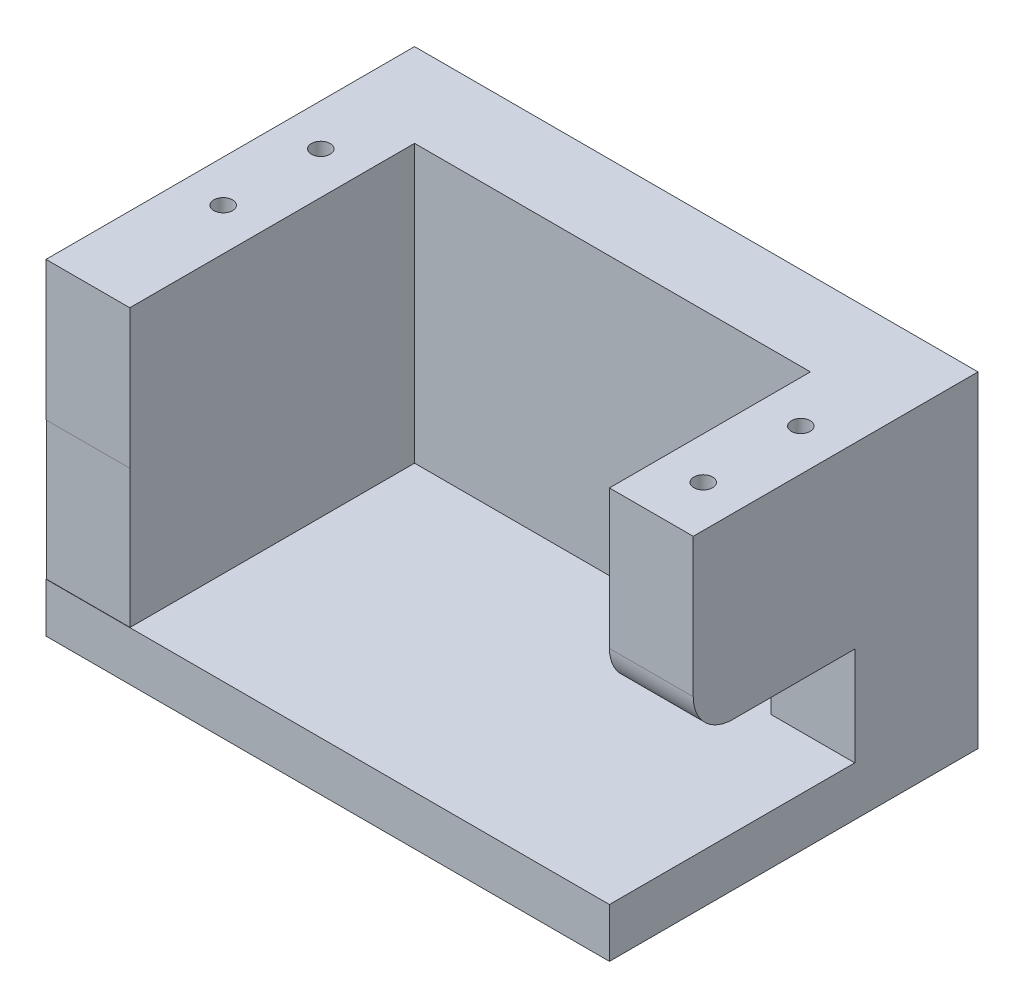
ISO-10303-21;
HEADER;
FILE_DESCRIPTION(('STEP AP214'),'2;1');
FILE_NAME('part.step','',(''),(''),'','','');
FILE_SCHEMA(('AUTOMOTIVE_DESIGN { 1 0 10303 214 1 1 1 1 }'));
ENDSEC;
DATA;
#1=APPLICATION_CONTEXT('core data for automotive mechanical design processes');
#2=APPLICATION_PROTOCOL_DEFINITION('international standard','automotive_design',2000,#1);
#3=PRODUCT_CONTEXT('',#1,'mechanical');
#4=PRODUCT('Part','Part','',(#3));
#5=PRODUCT_RELATED_PRODUCT_CATEGORY('part','',(#4));
#6=PRODUCT_DEFINITION_FORMATION('','',#4);
#7=PRODUCT_DEFINITION_CONTEXT('part definition',#1,'design');
#8=PRODUCT_DEFINITION('design','',#6,#7);
#9=PRODUCT_DEFINITION_SHAPE('','',#8);
#10=(LENGTH_UNIT() NAMED_UNIT(*) SI_UNIT(.MILLI.,.METRE.));
#11=(NAMED_UNIT(*) PLANE_ANGLE_UNIT() SI_UNIT($,.RADIAN.));
#12=(NAMED_UNIT(*) SI_UNIT($,.STERADIAN.) SOLID_ANGLE_UNIT());
#13=UNCERTAINTY_MEASURE_WITH_UNIT(LENGTH_MEASURE(1.E-05),#10,'distance_accuracy_value','');
#14=(GEOMETRIC_REPRESENTATION_CONTEXT(3) GLOBAL_UNCERTAINTY_ASSIGNED_CONTEXT((#13)) GLOBAL_UNIT_ASSIGNED_CONTEXT((#10,
#11,#12)) REPRESENTATION_CONTEXT('',''));
#15=CARTESIAN_POINT('',(0.,0.,0.));
#16=DIRECTION('',(0.,0.,1.));
#17=DIRECTION('',(1.,0.,0.));
#18=AXIS2_PLACEMENT_3D('',#15,#16,#17);
#19=CARTESIAN_POINT('',(0.,5.,0.));
#20=DIRECTION('',(0.,1.,0.));
#21=DIRECTION('',(0.,0.,1.));
#22=AXIS2_PLACEMENT_3D('',#19,#20,#21);
#23=PLANE('',#22);
#24=DIRECTION('',(0.,0.,1.));
#25=VECTOR('',#24,1.);
#26=CARTESIAN_POINT('',(-20.08,5.,0.));
#27=LINE('',#26,#25);
#28=CARTESIAN_POINT('',(-20.08,5.,-10.195));
#29=VERTEX_POINT('',#28);
#30=CARTESIAN_POINT('',(-20.08,5.,18.6661792300598));
#31=VERTEX_POINT('',#30);
#32=EDGE_CURVE('E152',#29,#31,#27,.T.);
#33=ORIENTED_EDGE('',*,*,#32,.T.);
#34=DIRECTION('',(1.,0.,0.));
#35=VECTOR('',#34,1.);
#36=CARTESIAN_POINT('',(-28.58,5.,18.6661792300598));
#37=LINE('',#36,#35);
#38=CARTESIAN_POINT('',(-28.58,5.,18.6661792300598));
#39=VERTEX_POINT('',#38);
#40=EDGE_CURVE('E155',#39,#31,#37,.T.);
#41=ORIENTED_EDGE('',*,*,#40,.F.);
#42=DIRECTION('',(0.,0.,-1.));
#43=VECTOR('',#42,1.);
#44=CARTESIAN_POINT('',(-28.58,5.,10.195));
#45=LINE('',#44,#43);
#46=CARTESIAN_POINT('',(-28.58,5.,18.695));
#47=VERTEX_POINT('',#46);
#48=EDGE_CURVE('E247',#47,#39,#45,.T.);
#49=ORIENTED_EDGE('',*,*,#48,.F.);
#50=DIRECTION('',(-1.,0.,0.));
#51=VECTOR('',#50,1.);
#52=CARTESIAN_POINT('',(20.08,5.,18.695));
#53=LINE('',#52,#51);
#54=CARTESIAN_POINT('',(28.58,5.,18.695));
#55=VERTEX_POINT('',#54);
#56=EDGE_CURVE('E160',#55,#47,#53,.T.);
#57=ORIENTED_EDGE('',*,*,#56,.F.);
#58=DIRECTION('',(0.,0.,-1.));
#59=VECTOR('',#58,1.);
#60=CARTESIAN_POINT('',(28.58,5.,0.));
#61=LINE('',#60,#59);
#62=CARTESIAN_POINT('',(28.58,5.,-6.195));
#63=VERTEX_POINT('',#62);
#64=EDGE_CURVE('E194',#55,#63,#61,.T.);
#65=ORIENTED_EDGE('',*,*,#64,.T.);
#66=DIRECTION('',(-1.,0.,0.));
#67=VECTOR('',#66,1.);
#68=CARTESIAN_POINT('',(28.581,5.,-6.195));
#69=LINE('',#68,#67);
#70=CARTESIAN_POINT('',(20.08,5.,-6.195));
#71=VERTEX_POINT('',#70);
#72=EDGE_CURVE('E218',#63,#71,#69,.T.);
#73=ORIENTED_EDGE('',*,*,#72,.T.);
#74=DIRECTION('',(0.,0.,-1.));
#75=VECTOR('',#74,1.);
#76=CARTESIAN_POINT('',(20.08,5.,0.));
#77=LINE('',#76,#75);
#78=CARTESIAN_POINT('',(20.08,5.,-10.195));
#79=VERTEX_POINT('',#78);
#80=EDGE_CURVE('E256',#71,#79,#77,.T.);
#81=ORIENTED_EDGE('',*,*,#80,.T.);
#82=DIRECTION('',(-1.,0.,0.));
#83=VECTOR('',#82,1.);
#84=CARTESIAN_POINT('',(0.,5.,-10.195));
#85=LINE('',#84,#83);
#86=EDGE_CURVE('E157',#79,#29,#85,.T.);
#87=ORIENTED_EDGE('',*,*,#86,.T.);
#88=EDGE_LOOP('',(#33,#41,#49,#57,#65,#73,#81,#87));
#89=FACE_BOUND('',#88,.T.);
#90=ADVANCED_FACE('F45',(#89),#23,.T.);
#91=CARTESIAN_POINT('',(0.,19.,0.));
#92=DIRECTION('',(0.,-1.,0.));
#93=DIRECTION('',(0.,0.,-1.));
#94=AXIS2_PLACEMENT_3D('',#91,#92,#93);
#95=PLANE('',#94);
#96=DIRECTION('',(0.,0.,1.));
#97=VECTOR('',#96,1.);
#98=CARTESIAN_POINT('',(-28.58,19.,10.195));
#99=LINE('',#98,#97);
#100=CARTESIAN_POINT('',(-28.58,19.,18.6661792300598));
#101=VERTEX_POINT('',#100);
#102=CARTESIAN_POINT('',(-28.58,19.,18.695));
#103=VERTEX_POINT('',#102);
#104=EDGE_CURVE('E178',#101,#103,#99,.T.);
#105=ORIENTED_EDGE('',*,*,#104,.F.);
#106=DIRECTION('',(-1.,0.,0.));
#107=VECTOR('',#106,1.);
#108=CARTESIAN_POINT('',(-28.58,19.,18.6661792300598));
#109=LINE('',#108,#107);
#110=CARTESIAN_POINT('',(-20.08,19.,18.6661792300598));
#111=VERTEX_POINT('',#110);
#112=EDGE_CURVE('E173',#111,#101,#109,.T.);
#113=ORIENTED_EDGE('',*,*,#112,.F.);
#114=DIRECTION('',(0.,0.,-1.));
#115=VECTOR('',#114,1.);
#116=CARTESIAN_POINT('',(-20.08,19.,10.195));
#117=LINE('',#116,#115);
#118=CARTESIAN_POINT('',(-20.08,19.,18.695));
#119=VERTEX_POINT('',#118);
#120=EDGE_CURVE('E166',#119,#111,#117,.T.);
#121=ORIENTED_EDGE('',*,*,#120,.F.);
#122=DIRECTION('',(1.,0.,0.));
#123=VECTOR('',#122,1.);
#124=CARTESIAN_POINT('',(-20.08,19.,18.695));
#125=LINE('',#124,#123);
#126=EDGE_CURVE('E180',#103,#119,#125,.T.);
#127=ORIENTED_EDGE('',*,*,#126,.F.);
#128=EDGE_LOOP('',(#105,#113,#121,#127));
#129=FACE_BOUND('',#128,.T.);
#130=ADVANCED_FACE('F341',(#129),#95,.T.);
#131=CARTESIAN_POINT('',(28.58,5.,0.));
#132=DIRECTION('',(-1.,0.,0.));
#133=DIRECTION('',(0.,0.,1.));
#134=AXIS2_PLACEMENT_3D('',#131,#132,#133);
#135=PLANE('',#134);
#136=DIRECTION('',(0.,-1.,0.));
#137=VECTOR('',#136,1.);
#138=CARTESIAN_POINT('',(28.58,0.,10.195));
#139=LINE('',#138,#137);
#140=CARTESIAN_POINT('',(28.58,33.1,10.195));
#141=VERTEX_POINT('',#140);
#142=CARTESIAN_POINT('',(28.58,19.,10.195));
#143=VERTEX_POINT('',#142);
#144=EDGE_CURVE('E199',#141,#143,#139,.T.);
#145=ORIENTED_EDGE('',*,*,#144,.T.);
#146=CARTESIAN_POINT('',(28.58,19.,6.19500000000001));
#147=DIRECTION('',(-1.,0.,0.));
#148=DIRECTION('',(0.,0.,1.));
#149=AXIS2_PLACEMENT_3D('',#146,#147,#148);
#150=CIRCLE('',#149,4.);
#151=CARTESIAN_POINT('',(28.58,15.,6.19500000000001));
#152=VERTEX_POINT('',#151);
#153=EDGE_CURVE('E196',#143,#152,#150,.F.);
#154=ORIENTED_EDGE('',*,*,#153,.T.);
#155=DIRECTION('',(0.,0.,-1.));
#156=VECTOR('',#155,1.);
#157=CARTESIAN_POINT('',(28.58,15.,0.));
#158=LINE('',#157,#156);
#159=CARTESIAN_POINT('',(28.58,15.,-6.195));
#160=VERTEX_POINT('',#159);
#161=EDGE_CURVE('E215',#152,#160,#158,.T.);
#162=ORIENTED_EDGE('',*,*,#161,.T.);
#163=DIRECTION('',(0.,-1.,0.));
#164=VECTOR('',#163,1.);
#165=CARTESIAN_POINT('',(28.58,0.,-6.195));
#166=LINE('',#165,#164);
#167=EDGE_CURVE('E189',#160,#63,#166,.T.);
#168=ORIENTED_EDGE('',*,*,#167,.T.);
#169=ORIENTED_EDGE('',*,*,#64,.F.);
#170=DIRECTION('',(0.,-1.,0.));
#171=VECTOR('',#170,1.);
#172=CARTESIAN_POINT('',(28.58,5.,18.695));
#173=LINE('',#172,#171);
#174=CARTESIAN_POINT('',(28.58,0.,18.695));
#175=VERTEX_POINT('',#174);
#176=EDGE_CURVE('E53',#55,#175,#173,.T.);
#177=ORIENTED_EDGE('',*,*,#176,.T.);
#178=DIRECTION('',(0.,0.,-1.));
#179=VECTOR('',#178,1.);
#180=CARTESIAN_POINT('',(28.58,0.,0.));
#181=LINE('',#180,#179);
#182=CARTESIAN_POINT('',(28.58,0.,-18.695));
#183=VERTEX_POINT('',#182);
#184=EDGE_CURVE('E281',#175,#183,#181,.T.);
#185=ORIENTED_EDGE('',*,*,#184,.T.);
#186=DIRECTION('',(0.,-1.,0.));
#187=VECTOR('',#186,1.);
#188=CARTESIAN_POINT('',(28.58,5.,-18.695));
#189=LINE('',#188,#187);
#190=CARTESIAN_POINT('',(28.58,33.1,-18.695));
#191=VERTEX_POINT('',#190);
#192=EDGE_CURVE('E289',#191,#183,#189,.T.);
#193=ORIENTED_EDGE('',*,*,#192,.F.);
#194=DIRECTION('',(0.,0.,-1.));
#195=VECTOR('',#194,1.);
#196=CARTESIAN_POINT('',(28.58,33.1,0.));
#197=LINE('',#196,#195);
#198=EDGE_CURVE('E266',#141,#191,#197,.T.);
#199=ORIENTED_EDGE('',*,*,#198,.F.);
#200=EDGE_LOOP('',(#145,#154,#162,#168,#169,#177,#185,#193,#199));
#201=FACE_BOUND('',#200,.T.);
#202=ADVANCED_FACE('F293',(#201),#135,.F.);
#203=CARTESIAN_POINT('',(20.08,33.1,0.));
#204=DIRECTION('',(-1.,0.,0.));
#205=DIRECTION('',(0.,0.,1.));
#206=AXIS2_PLACEMENT_3D('',#203,#204,#205);
#207=PLANE('',#206);
#208=CARTESIAN_POINT('',(20.08,19.,6.19500000000001));
#209=DIRECTION('',(-1.,0.,0.));
#210=DIRECTION('',(0.,0.,1.));
#211=AXIS2_PLACEMENT_3D('',#208,#209,#210);
#212=CIRCLE('',#211,4.);
#213=CARTESIAN_POINT('',(20.08,15.,6.19500000000001));
#214=VERTEX_POINT('',#213);
#215=CARTESIAN_POINT('',(20.08,19.,10.195));
#216=VERTEX_POINT('',#215);
#217=EDGE_CURVE('E202',#214,#216,#212,.T.);
#218=ORIENTED_EDGE('',*,*,#217,.T.);
#219=DIRECTION('',(0.,1.,0.));
#220=VECTOR('',#219,1.);
#221=CARTESIAN_POINT('',(20.08,0.,10.195));
#222=LINE('',#221,#220);
#223=CARTESIAN_POINT('',(20.08,33.1,10.195));
#224=VERTEX_POINT('',#223);
#225=EDGE_CURVE('E209',#216,#224,#222,.T.);
#226=ORIENTED_EDGE('',*,*,#225,.T.);
#227=DIRECTION('',(0.,0.,-1.));
#228=VECTOR('',#227,1.);
#229=CARTESIAN_POINT('',(20.08,33.1,0.));
#230=LINE('',#229,#228);
#231=CARTESIAN_POINT('',(20.08,33.1,-10.195));
#232=VERTEX_POINT('',#231);
#233=EDGE_CURVE('E259',#224,#232,#230,.T.);
#234=ORIENTED_EDGE('',*,*,#233,.T.);
#235=DIRECTION('',(0.,-1.,0.));
#236=VECTOR('',#235,1.);
#237=CARTESIAN_POINT('',(20.08,33.1,-10.195));
#238=LINE('',#237,#236);
#239=EDGE_CURVE('E267',#232,#79,#238,.T.);
#240=ORIENTED_EDGE('',*,*,#239,.T.);
#241=ORIENTED_EDGE('',*,*,#80,.F.);
#242=DIRECTION('',(0.,1.,0.));
#243=VECTOR('',#242,1.);
#244=CARTESIAN_POINT('',(20.08,0.,-6.195));
#245=LINE('',#244,#243);
#246=CARTESIAN_POINT('',(20.08,15.,-6.195));
#247=VERTEX_POINT('',#246);
#248=EDGE_CURVE('E68',#71,#247,#245,.T.);
#249=ORIENTED_EDGE('',*,*,#248,.T.);
#250=DIRECTION('',(0.,0.,1.));
#251=VECTOR('',#250,1.);
#252=CARTESIAN_POINT('',(20.08,15.,0.));
#253=LINE('',#252,#251);
#254=EDGE_CURVE('E205',#247,#214,#253,.T.);
#255=ORIENTED_EDGE('',*,*,#254,.T.);
#256=EDGE_LOOP('',(#218,#226,#234,#240,#241,#249,#255));
#257=FACE_BOUND('',#256,.T.);
#258=ADVANCED_FACE('F319',(#257),#207,.T.);
#259=CARTESIAN_POINT('',(0.,33.1,0.));
#260=DIRECTION('',(0.,1.,0.));
#261=DIRECTION('',(0.,0.,1.));
#262=AXIS2_PLACEMENT_3D('',#259,#260,#261);
#263=PLANE('',#262);
#264=CARTESIAN_POINT('',(24.35,33.1,4.95));
#265=DIRECTION('',(0.,1.,0.));
#266=DIRECTION('',(0.,0.,-1.));
#267=AXIS2_PLACEMENT_3D('',#264,#265,#266);
#268=CIRCLE('',#267,0.950000000000001);
#269=CARTESIAN_POINT('',(24.35,33.1,4.));
#270=VERTEX_POINT('',#269);
#271=EDGE_CURVE('E239',#270,#270,#268,.T.);
#272=ORIENTED_EDGE('',*,*,#271,.F.);
#273=EDGE_LOOP('',(#272));
#274=FACE_BOUND('',#273,.T.);
#275=CARTESIAN_POINT('',(24.35,33.1,-4.95));
#276=DIRECTION('',(0.,1.,0.));
#277=DIRECTION('',(0.,0.,1.));
#278=AXIS2_PLACEMENT_3D('',#275,#276,#277);
#279=CIRCLE('',#278,0.950000000000001);
#280=CARTESIAN_POINT('',(24.35,33.1,-4.));
#281=VERTEX_POINT('',#280);
#282=EDGE_CURVE('E233',#281,#281,#279,.T.);
#283=ORIENTED_EDGE('',*,*,#282,.F.);
#284=EDGE_LOOP('',(#283));
#285=FACE_BOUND('',#284,.T.);
#286=CARTESIAN_POINT('',(-24.35,33.1,-4.95));
#287=DIRECTION('',(0.,1.,0.));
#288=DIRECTION('',(0.,0.,-1.));
#289=AXIS2_PLACEMENT_3D('',#286,#287,#288);
#290=CIRCLE('',#289,0.950000000000001);
#291=CARTESIAN_POINT('',(-24.35,33.1,-5.9));
#292=VERTEX_POINT('',#291);
#293=EDGE_CURVE('E226',#292,#292,#290,.T.);
#294=ORIENTED_EDGE('',*,*,#293,.F.);
#295=EDGE_LOOP('',(#294));
#296=FACE_BOUND('',#295,.T.);
#297=CARTESIAN_POINT('',(-24.35,33.1,4.95));
#298=DIRECTION('',(0.,1.,0.));
#299=DIRECTION('',(0.,0.,1.));
#300=AXIS2_PLACEMENT_3D('',#297,#298,#299);
#301=CIRCLE('',#300,0.950000000000001);
#302=CARTESIAN_POINT('',(-24.35,33.1,5.9));
#303=VERTEX_POINT('',#302);
#304=EDGE_CURVE('E229',#303,#303,#301,.T.);
#305=ORIENTED_EDGE('',*,*,#304,.F.);
#306=EDGE_LOOP('',(#305));
#307=FACE_BOUND('',#306,.T.);
#308=ORIENTED_EDGE('',*,*,#233,.F.);
#309=DIRECTION('',(-1.,0.,0.));
#310=VECTOR('',#309,1.);
#311=CARTESIAN_POINT('',(28.581,33.1,10.195));
#312=LINE('',#311,#310);
#313=EDGE_CURVE('E216',#141,#224,#312,.T.);
#314=ORIENTED_EDGE('',*,*,#313,.F.);
#315=ORIENTED_EDGE('',*,*,#198,.T.);
#316=DIRECTION('',(-1.,0.,0.));
#317=VECTOR('',#316,1.);
#318=CARTESIAN_POINT('',(0.,33.1,-18.695));
#319=LINE('',#318,#317);
#320=CARTESIAN_POINT('',(-28.58,33.1,-18.695));
#321=VERTEX_POINT('',#320);
#322=EDGE_CURVE('E261',#191,#321,#319,.T.);
#323=ORIENTED_EDGE('',*,*,#322,.T.);
#324=DIRECTION('',(0.,0.,1.));
#325=VECTOR('',#324,1.);
#326=CARTESIAN_POINT('',(-28.58,33.1,0.));
#327=LINE('',#326,#325);
#328=CARTESIAN_POINT('',(-28.58,33.1,18.695));
#329=VERTEX_POINT('',#328);
#330=EDGE_CURVE('E264',#321,#329,#327,.T.);
#331=ORIENTED_EDGE('',*,*,#330,.T.);
#332=DIRECTION('',(1.,0.,0.));
#333=VECTOR('',#332,1.);
#334=CARTESIAN_POINT('',(-20.08,33.1,18.695));
#335=LINE('',#334,#333);
#336=CARTESIAN_POINT('',(-20.08,33.1,18.695));
#337=VERTEX_POINT('',#336);
#338=EDGE_CURVE('E176',#329,#337,#335,.T.);
#339=ORIENTED_EDGE('',*,*,#338,.T.);
#340=DIRECTION('',(0.,0.,1.));
#341=VECTOR('',#340,1.);
#342=CARTESIAN_POINT('',(-20.08,33.1,0.));
#343=LINE('',#342,#341);
#344=CARTESIAN_POINT('',(-20.08,33.1,-10.195));
#345=VERTEX_POINT('',#344);
#346=EDGE_CURVE('E253',#345,#337,#343,.T.);
#347=ORIENTED_EDGE('',*,*,#346,.F.);
#348=DIRECTION('',(-1.,0.,0.));
#349=VECTOR('',#348,1.);
#350=CARTESIAN_POINT('',(0.,33.1,-10.195));
#351=LINE('',#350,#349);
#352=EDGE_CURVE('E255',#232,#345,#351,.T.);
#353=ORIENTED_EDGE('',*,*,#352,.F.);
#354=EDGE_LOOP('',(#308,#314,#315,#323,#331,#339,#347,#353));
#355=FACE_BOUND('',#354,.T.);
#356=ADVANCED_FACE('F312',(#274,#285,#296,#307,#355),#263,.T.);
#357=CARTESIAN_POINT('',(-28.58,5.,0.));
#358=DIRECTION('',(-1.,0.,0.));
#359=DIRECTION('',(0.,0.,1.));
#360=AXIS2_PLACEMENT_3D('',#357,#358,#359);
#361=PLANE('',#360);
#362=ORIENTED_EDGE('',*,*,#48,.T.);
#363=DIRECTION('',(0.,-1.,0.));
#364=VECTOR('',#363,1.);
#365=CARTESIAN_POINT('',(-28.58,33.102,18.6661792300598));
#366=LINE('',#365,#364);
#367=EDGE_CURVE('E60',#101,#39,#366,.T.);
#368=ORIENTED_EDGE('',*,*,#367,.F.);
#369=ORIENTED_EDGE('',*,*,#104,.T.);
#370=DIRECTION('',(0.,1.,0.));
#371=VECTOR('',#370,1.);
#372=CARTESIAN_POINT('',(-28.58,19.,18.695));
#373=LINE('',#372,#371);
#374=EDGE_CURVE('E183',#103,#329,#373,.T.);
#375=ORIENTED_EDGE('',*,*,#374,.T.);
#376=ORIENTED_EDGE('',*,*,#330,.F.);
#377=DIRECTION('',(0.,-1.,0.));
#378=VECTOR('',#377,1.);
#379=CARTESIAN_POINT('',(-28.58,5.,-18.695));
#380=LINE('',#379,#378);
#381=CARTESIAN_POINT('',(-28.58,0.,-18.695));
#382=VERTEX_POINT('',#381);
#383=EDGE_CURVE('E287',#321,#382,#380,.T.);
#384=ORIENTED_EDGE('',*,*,#383,.T.);
#385=DIRECTION('',(0.,0.,-1.));
#386=VECTOR('',#385,1.);
#387=CARTESIAN_POINT('',(-28.58,0.,0.));
#388=LINE('',#387,#386);
#389=CARTESIAN_POINT('',(-28.58,0.,18.695));
#390=VERTEX_POINT('',#389);
#391=EDGE_CURVE('E275',#390,#382,#388,.T.);
#392=ORIENTED_EDGE('',*,*,#391,.F.);
#393=DIRECTION('',(0.,-1.,0.));
#394=VECTOR('',#393,1.);
#395=CARTESIAN_POINT('',(-28.58,5.,18.695));
#396=LINE('',#395,#394);
#397=EDGE_CURVE('E11',#47,#390,#396,.T.);
#398=ORIENTED_EDGE('',*,*,#397,.F.);
#399=EDGE_LOOP('',(#362,#368,#369,#375,#376,#384,#392,#398));
#400=FACE_BOUND('',#399,.T.);
#401=ADVANCED_FACE('F47',(#400),#361,.T.);
#402=CARTESIAN_POINT('',(0.,5.,18.695));
#403=DIRECTION('',(0.,0.,-1.));
#404=DIRECTION('',(-1.,0.,0.));
#405=AXIS2_PLACEMENT_3D('',#402,#403,#404);
#406=PLANE('',#405);
#407=ORIENTED_EDGE('',*,*,#176,.F.);
#408=ORIENTED_EDGE('',*,*,#56,.T.);
#409=ORIENTED_EDGE('',*,*,#397,.T.);
#410=DIRECTION('',(1.,0.,0.));
#411=VECTOR('',#410,1.);
#412=CARTESIAN_POINT('',(0.,0.,18.695));
#413=LINE('',#412,#411);
#414=EDGE_CURVE('E278',#390,#175,#413,.T.);
#415=ORIENTED_EDGE('',*,*,#414,.T.);
#416=EDGE_LOOP('',(#407,#408,#409,#415));
#417=FACE_BOUND('',#416,.T.);
#418=ADVANCED_FACE('F298',(#417),#406,.F.);
#419=CARTESIAN_POINT('',(0.,5.,-18.695));
#420=DIRECTION('',(0.,0.,-1.));
#421=DIRECTION('',(-1.,0.,0.));
#422=AXIS2_PLACEMENT_3D('',#419,#420,#421);
#423=PLANE('',#422);
#424=DIRECTION('',(1.,0.,0.));
#425=VECTOR('',#424,1.);
#426=CARTESIAN_POINT('',(0.,0.,-18.695));
#427=LINE('',#426,#425);
#428=EDGE_CURVE('E284',#382,#183,#427,.T.);
#429=ORIENTED_EDGE('',*,*,#428,.F.);
#430=ORIENTED_EDGE('',*,*,#383,.F.);
#431=ORIENTED_EDGE('',*,*,#322,.F.);
#432=ORIENTED_EDGE('',*,*,#192,.T.);
#433=EDGE_LOOP('',(#429,#430,#431,#432));
#434=FACE_BOUND('',#433,.T.);
#435=ADVANCED_FACE('F305',(#434),#423,.T.);
#436=CARTESIAN_POINT('',(0.,0.,0.));
#437=DIRECTION('',(0.,1.,0.));
#438=DIRECTION('',(0.,0.,1.));
#439=AXIS2_PLACEMENT_3D('',#436,#437,#438);
#440=PLANE('',#439);
#441=ORIENTED_EDGE('',*,*,#391,.T.);
#442=ORIENTED_EDGE('',*,*,#428,.T.);
#443=ORIENTED_EDGE('',*,*,#184,.F.);
#444=ORIENTED_EDGE('',*,*,#414,.F.);
#445=EDGE_LOOP('',(#441,#442,#443,#444));
#446=FACE_BOUND('',#445,.T.);
#447=ADVANCED_FACE('F302',(#446),#440,.F.);
#448=CARTESIAN_POINT('',(-20.08,33.1,0.));
#449=DIRECTION('',(1.,0.,0.));
#450=DIRECTION('',(0.,0.,-1.));
#451=AXIS2_PLACEMENT_3D('',#448,#449,#450);
#452=PLANE('',#451);
#453=DIRECTION('',(0.,-1.,0.));
#454=VECTOR('',#453,1.);
#455=CARTESIAN_POINT('',(-20.08,33.102,18.6661792300598));
#456=LINE('',#455,#454);
#457=EDGE_CURVE('E163',#111,#31,#456,.T.);
#458=ORIENTED_EDGE('',*,*,#457,.T.);
#459=ORIENTED_EDGE('',*,*,#32,.F.);
#460=DIRECTION('',(0.,-1.,0.));
#461=VECTOR('',#460,1.);
#462=CARTESIAN_POINT('',(-20.08,33.1,-10.195));
#463=LINE('',#462,#461);
#464=EDGE_CURVE('E273',#345,#29,#463,.T.);
#465=ORIENTED_EDGE('',*,*,#464,.F.);
#466=ORIENTED_EDGE('',*,*,#346,.T.);
#467=DIRECTION('',(0.,1.,0.));
#468=VECTOR('',#467,1.);
#469=CARTESIAN_POINT('',(-20.08,19.,18.695));
#470=LINE('',#469,#468);
#471=EDGE_CURVE('E186',#119,#337,#470,.T.);
#472=ORIENTED_EDGE('',*,*,#471,.F.);
#473=ORIENTED_EDGE('',*,*,#120,.T.);
#474=EDGE_LOOP('',(#458,#459,#465,#466,#472,#473));
#475=FACE_BOUND('',#474,.T.);
#476=ADVANCED_FACE('F164',(#475),#452,.T.);
#477=CARTESIAN_POINT('',(0.,33.1,-10.195));
#478=DIRECTION('',(0.,0.,1.));
#479=DIRECTION('',(1.,0.,0.));
#480=AXIS2_PLACEMENT_3D('',#477,#478,#479);
#481=PLANE('',#480);
#482=ORIENTED_EDGE('',*,*,#86,.F.);
#483=ORIENTED_EDGE('',*,*,#239,.F.);
#484=ORIENTED_EDGE('',*,*,#352,.T.);
#485=ORIENTED_EDGE('',*,*,#464,.T.);
#486=EDGE_LOOP('',(#482,#483,#484,#485));
#487=FACE_BOUND('',#486,.T.);
#488=ADVANCED_FACE('F332',(#487),#481,.T.);
#489=CARTESIAN_POINT('',(-24.35,21.1,4.95));
#490=DIRECTION('',(0.,1.,0.));
#491=DIRECTION('',(0.,0.,1.));
#492=AXIS2_PLACEMENT_3D('',#489,#490,#491);
#493=CYLINDRICAL_SURFACE('',#492,0.950000000000001);
#494=CARTESIAN_POINT('',(-24.35,21.1,4.95));
#495=DIRECTION('',(0.,1.,0.));
#496=DIRECTION('',(0.,0.,1.));
#497=AXIS2_PLACEMENT_3D('',#494,#495,#496);
#498=CIRCLE('',#497,0.950000000000001);
#499=CARTESIAN_POINT('',(-24.35,21.1,5.9));
#500=VERTEX_POINT('',#499);
#501=EDGE_CURVE('E244',#500,#500,#498,.T.);
#502=ORIENTED_EDGE('',*,*,#501,.F.);
#503=EDGE_LOOP('',(#502));
#504=FACE_BOUND('',#503,.T.);
#505=ORIENTED_EDGE('',*,*,#304,.T.);
#506=EDGE_LOOP('',(#505));
#507=FACE_BOUND('',#506,.T.);
#508=ADVANCED_FACE('F374',(#504,#507),#493,.F.);
#509=CARTESIAN_POINT('',(-24.35,21.1,4.95));
#510=DIRECTION('',(0.,1.,0.));
#511=DIRECTION('',(0.,0.,1.));
#512=AXIS2_PLACEMENT_3D('',#509,#510,#511);
#513=PLANE('',#512);
#514=ORIENTED_EDGE('',*,*,#501,.T.);
#515=EDGE_LOOP('',(#514));
#516=FACE_BOUND('',#515,.T.);
#517=ADVANCED_FACE('F378',(#516),#513,.T.);
#518=CARTESIAN_POINT('',(-24.35,21.1,-4.95));
#519=DIRECTION('',(0.,1.,0.));
#520=DIRECTION('',(0.,0.,1.));
#521=AXIS2_PLACEMENT_3D('',#518,#519,#520);
#522=CYLINDRICAL_SURFACE('',#521,0.950000000000001);
#523=CARTESIAN_POINT('',(-24.35,21.1,-4.95));
#524=DIRECTION('',(0.,1.,0.));
#525=DIRECTION('',(0.,0.,-1.));
#526=AXIS2_PLACEMENT_3D('',#523,#524,#525);
#527=CIRCLE('',#526,0.950000000000001);
#528=CARTESIAN_POINT('',(-24.35,21.1,-5.9));
#529=VERTEX_POINT('',#528);
#530=EDGE_CURVE('E230',#529,#529,#527,.T.);
#531=ORIENTED_EDGE('',*,*,#530,.F.);
#532=EDGE_LOOP('',(#531));
#533=FACE_BOUND('',#532,.T.);
#534=ORIENTED_EDGE('',*,*,#293,.T.);
#535=EDGE_LOOP('',(#534));
#536=FACE_BOUND('',#535,.T.);
#537=ADVANCED_FACE('F499',(#533,#536),#522,.F.);
#538=CARTESIAN_POINT('',(-24.35,21.1,-4.95));
#539=DIRECTION('',(0.,-1.,0.));
#540=DIRECTION('',(0.,0.,-1.));
#541=AXIS2_PLACEMENT_3D('',#538,#539,#540);
#542=PLANE('',#541);
#543=ORIENTED_EDGE('',*,*,#530,.T.);
#544=EDGE_LOOP('',(#543));
#545=FACE_BOUND('',#544,.T.);
#546=ADVANCED_FACE('F490',(#545),#542,.F.);
#547=CARTESIAN_POINT('',(24.35,21.1,-4.95));
#548=DIRECTION('',(0.,1.,0.));
#549=DIRECTION('',(0.,0.,1.));
#550=AXIS2_PLACEMENT_3D('',#547,#548,#549);
#551=CYLINDRICAL_SURFACE('',#550,0.950000000000001);
#552=CARTESIAN_POINT('',(24.35,21.1,-4.95));
#553=DIRECTION('',(0.,1.,0.));
#554=DIRECTION('',(0.,0.,1.));
#555=AXIS2_PLACEMENT_3D('',#552,#553,#554);
#556=CIRCLE('',#555,0.950000000000001);
#557=CARTESIAN_POINT('',(24.35,21.1,-4.));
#558=VERTEX_POINT('',#557);
#559=EDGE_CURVE('E236',#558,#558,#556,.T.);
#560=ORIENTED_EDGE('',*,*,#559,.F.);
#561=EDGE_LOOP('',(#560));
#562=FACE_BOUND('',#561,.T.);
#563=ORIENTED_EDGE('',*,*,#282,.T.);
#564=EDGE_LOOP('',(#563));
#565=FACE_BOUND('',#564,.T.);
#566=ADVANCED_FACE('F481',(#562,#565),#551,.F.);
#567=CARTESIAN_POINT('',(24.35,21.1,-4.95));
#568=DIRECTION('',(0.,1.,0.));
#569=DIRECTION('',(0.,0.,1.));
#570=AXIS2_PLACEMENT_3D('',#567,#568,#569);
#571=PLANE('',#570);
#572=ORIENTED_EDGE('',*,*,#559,.T.);
#573=EDGE_LOOP('',(#572));
#574=FACE_BOUND('',#573,.T.);
#575=ADVANCED_FACE('F472',(#574),#571,.T.);
#576=CARTESIAN_POINT('',(24.35,21.1,4.95));
#577=DIRECTION('',(0.,1.,0.));
#578=DIRECTION('',(0.,0.,1.));
#579=AXIS2_PLACEMENT_3D('',#576,#577,#578);
#580=CYLINDRICAL_SURFACE('',#579,0.950000000000001);
#581=CARTESIAN_POINT('',(24.35,21.1,4.95));
#582=DIRECTION('',(0.,1.,0.));
#583=DIRECTION('',(0.,0.,-1.));
#584=AXIS2_PLACEMENT_3D('',#581,#582,#583);
#585=CIRCLE('',#584,0.950000000000001);
#586=CARTESIAN_POINT('',(24.35,21.1,4.));
#587=VERTEX_POINT('',#586);
#588=EDGE_CURVE('E225',#587,#587,#585,.T.);
#589=ORIENTED_EDGE('',*,*,#588,.F.);
#590=EDGE_LOOP('',(#589));
#591=FACE_BOUND('',#590,.T.);
#592=ORIENTED_EDGE('',*,*,#271,.T.);
#593=EDGE_LOOP('',(#592));
#594=FACE_BOUND('',#593,.T.);
#595=ADVANCED_FACE('F463',(#591,#594),#580,.F.);
#596=CARTESIAN_POINT('',(24.35,21.1,4.95));
#597=DIRECTION('',(0.,-1.,0.));
#598=DIRECTION('',(0.,0.,-1.));
#599=AXIS2_PLACEMENT_3D('',#596,#597,#598);
#600=PLANE('',#599);
#601=ORIENTED_EDGE('',*,*,#588,.T.);
#602=EDGE_LOOP('',(#601));
#603=FACE_BOUND('',#602,.T.);
#604=ADVANCED_FACE('F437',(#603),#600,.F.);
#605=CARTESIAN_POINT('',(28.581,19.,6.19500000000001));
#606=DIRECTION('',(-1.,0.,0.));
#607=DIRECTION('',(0.,0.,1.));
#608=AXIS2_PLACEMENT_3D('',#605,#606,#607);
#609=CYLINDRICAL_SURFACE('',#608,4.);
#610=DIRECTION('',(-1.,0.,0.));
#611=VECTOR('',#610,1.);
#612=CARTESIAN_POINT('',(28.581,19.,10.195));
#613=LINE('',#612,#611);
#614=EDGE_CURVE('E213',#143,#216,#613,.T.);
#615=ORIENTED_EDGE('',*,*,#614,.T.);
#616=ORIENTED_EDGE('',*,*,#217,.F.);
#617=DIRECTION('',(-1.,0.,0.));
#618=VECTOR('',#617,1.);
#619=CARTESIAN_POINT('',(28.581,15.,6.19500000000001));
#620=LINE('',#619,#618);
#621=EDGE_CURVE('E212',#152,#214,#620,.T.);
#622=ORIENTED_EDGE('',*,*,#621,.F.);
#623=ORIENTED_EDGE('',*,*,#153,.F.);
#624=EDGE_LOOP('',(#615,#616,#622,#623));
#625=FACE_BOUND('',#624,.T.);
#626=ADVANCED_FACE('F325',(#625),#609,.T.);
#627=CARTESIAN_POINT('',(28.581,0.,10.195));
#628=DIRECTION('',(0.,0.,1.));
#629=DIRECTION('',(0.,-1.,0.));
#630=AXIS2_PLACEMENT_3D('',#627,#628,#629);
#631=PLANE('',#630);
#632=ORIENTED_EDGE('',*,*,#313,.T.);
#633=ORIENTED_EDGE('',*,*,#225,.F.);
#634=ORIENTED_EDGE('',*,*,#614,.F.);
#635=ORIENTED_EDGE('',*,*,#144,.F.);
#636=EDGE_LOOP('',(#632,#633,#634,#635));
#637=FACE_BOUND('',#636,.T.);
#638=ADVANCED_FACE('F316',(#637),#631,.T.);
#639=CARTESIAN_POINT('',(28.581,0.,-6.195));
#640=DIRECTION('',(0.,0.,1.));
#641=DIRECTION('',(1.,0.,0.));
#642=AXIS2_PLACEMENT_3D('',#639,#640,#641);
#643=PLANE('',#642);
#644=DIRECTION('',(-1.,0.,0.));
#645=VECTOR('',#644,1.);
#646=CARTESIAN_POINT('',(28.581,15.,-6.195));
#647=LINE('',#646,#645);
#648=EDGE_CURVE('E220',#160,#247,#647,.T.);
#649=ORIENTED_EDGE('',*,*,#648,.T.);
#650=ORIENTED_EDGE('',*,*,#248,.F.);
#651=ORIENTED_EDGE('',*,*,#72,.F.);
#652=ORIENTED_EDGE('',*,*,#167,.F.);
#653=EDGE_LOOP('',(#649,#650,#651,#652));
#654=FACE_BOUND('',#653,.T.);
#655=ADVANCED_FACE('F329',(#654),#643,.T.);
#656=CARTESIAN_POINT('',(28.581,15.,0.));
#657=DIRECTION('',(0.,-1.,0.));
#658=DIRECTION('',(0.,0.,-1.));
#659=AXIS2_PLACEMENT_3D('',#656,#657,#658);
#660=PLANE('',#659);
#661=ORIENTED_EDGE('',*,*,#621,.T.);
#662=ORIENTED_EDGE('',*,*,#254,.F.);
#663=ORIENTED_EDGE('',*,*,#648,.F.);
#664=ORIENTED_EDGE('',*,*,#161,.F.);
#665=EDGE_LOOP('',(#661,#662,#663,#664));
#666=FACE_BOUND('',#665,.T.);
#667=ADVANCED_FACE('F328',(#666),#660,.T.);
#668=CARTESIAN_POINT('',(-20.08,19.,18.695));
#669=DIRECTION('',(0.,0.,1.));
#670=DIRECTION('',(1.,0.,0.));
#671=AXIS2_PLACEMENT_3D('',#668,#669,#670);
#672=PLANE('',#671);
#673=ORIENTED_EDGE('',*,*,#338,.F.);
#674=ORIENTED_EDGE('',*,*,#374,.F.);
#675=ORIENTED_EDGE('',*,*,#126,.T.);
#676=ORIENTED_EDGE('',*,*,#471,.T.);
#677=EDGE_LOOP('',(#673,#674,#675,#676));
#678=FACE_BOUND('',#677,.T.);
#679=ADVANCED_FACE('F337',(#678),#672,.T.);
#680=CARTESIAN_POINT('',(-28.58,33.102,18.6661792300598));
#681=DIRECTION('',(0.,0.,-1.));
#682=DIRECTION('',(-1.,0.,0.));
#683=AXIS2_PLACEMENT_3D('',#680,#681,#682);
#684=PLANE('',#683);
#685=ORIENTED_EDGE('',*,*,#457,.F.);
#686=ORIENTED_EDGE('',*,*,#112,.T.);
#687=ORIENTED_EDGE('',*,*,#367,.T.);
#688=ORIENTED_EDGE('',*,*,#40,.T.);
#689=EDGE_LOOP('',(#685,#686,#687,#688));
#690=FACE_BOUND('',#689,.T.);
#691=ADVANCED_FACE('F170',(#690),#684,.F.);
#692=CLOSED_SHELL('',(#90,#130,#202,#258,#356,#401,#418,#435,#447,#476,#488,#508,#517,#537,#546,
#566,#575,#595,#604,#626,#638,#655,#667,#679,#691));
#693=MANIFOLD_SOLID_BREP('B2',#692);
#694=ADVANCED_BREP_SHAPE_REPRESENTATION('',(#18,#693),#14);
#695=SHAPE_DEFINITION_REPRESENTATION(#9,#694);
ENDSEC;
END-ISO-10303-21;
